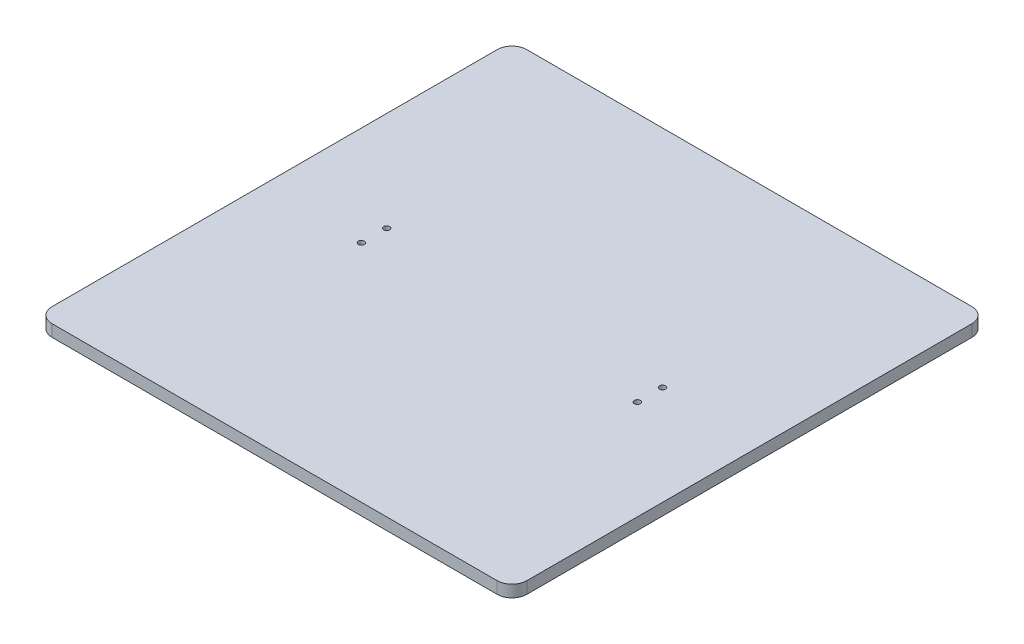
ISO-10303-21;
HEADER;
FILE_DESCRIPTION(('STEP AP214'),'2;1');
FILE_NAME('part.step','',(''),(''),'','','');
FILE_SCHEMA(('AUTOMOTIVE_DESIGN { 1 0 10303 214 1 1 1 1 }'));
ENDSEC;
DATA;
#1=APPLICATION_CONTEXT('core data for automotive mechanical design processes');
#2=APPLICATION_PROTOCOL_DEFINITION('international standard','automotive_design',2000,#1);
#3=PRODUCT_CONTEXT('',#1,'mechanical');
#4=PRODUCT('Part','Part','',(#3));
#5=PRODUCT_RELATED_PRODUCT_CATEGORY('part','',(#4));
#6=PRODUCT_DEFINITION_FORMATION('','',#4);
#7=PRODUCT_DEFINITION_CONTEXT('part definition',#1,'design');
#8=PRODUCT_DEFINITION('design','',#6,#7);
#9=PRODUCT_DEFINITION_SHAPE('','',#8);
#10=(LENGTH_UNIT() NAMED_UNIT(*) SI_UNIT(.MILLI.,.METRE.));
#11=(NAMED_UNIT(*) PLANE_ANGLE_UNIT() SI_UNIT($,.RADIAN.));
#12=(NAMED_UNIT(*) SI_UNIT($,.STERADIAN.) SOLID_ANGLE_UNIT());
#13=UNCERTAINTY_MEASURE_WITH_UNIT(LENGTH_MEASURE(1.E-05),#10,'distance_accuracy_value','');
#14=(GEOMETRIC_REPRESENTATION_CONTEXT(3) GLOBAL_UNCERTAINTY_ASSIGNED_CONTEXT((#13)) GLOBAL_UNIT_ASSIGNED_CONTEXT((#10,
#11,#12)) REPRESENTATION_CONTEXT('',''));
#15=CARTESIAN_POINT('',(0.,0.,0.));
#16=DIRECTION('',(0.,0.,1.));
#17=DIRECTION('',(1.,0.,0.));
#18=AXIS2_PLACEMENT_3D('',#15,#16,#17);
#19=CARTESIAN_POINT('',(150.,-8.,150.));
#20=DIRECTION('',(0.,1.,0.));
#21=DIRECTION('',(0.,0.,1.));
#22=AXIS2_PLACEMENT_3D('',#19,#20,#21);
#23=CYLINDRICAL_SURFACE('',#22,10.);
#24=CARTESIAN_POINT('',(150.,0.,150.));
#25=DIRECTION('',(0.,1.,0.));
#26=DIRECTION('',(0.,0.,-1.));
#27=AXIS2_PLACEMENT_3D('',#24,#25,#26);
#28=CIRCLE('',#27,10.);
#29=CARTESIAN_POINT('',(150.,0.,160.));
#30=VERTEX_POINT('',#29);
#31=CARTESIAN_POINT('',(160.,0.,150.));
#32=VERTEX_POINT('',#31);
#33=EDGE_CURVE('E135',#30,#32,#28,.T.);
#34=ORIENTED_EDGE('',*,*,#33,.F.);
#35=DIRECTION('',(0.,1.,0.));
#36=VECTOR('',#35,1.);
#37=CARTESIAN_POINT('',(150.,-8.,160.));
#38=LINE('',#37,#36);
#39=CARTESIAN_POINT('',(150.,-8.,160.));
#40=VERTEX_POINT('',#39);
#41=EDGE_CURVE('E11',#40,#30,#38,.T.);
#42=ORIENTED_EDGE('',*,*,#41,.F.);
#43=CARTESIAN_POINT('',(150.,-8.,150.));
#44=DIRECTION('',(0.,1.,0.));
#45=DIRECTION('',(0.,0.,-1.));
#46=AXIS2_PLACEMENT_3D('',#43,#44,#45);
#47=CIRCLE('',#46,10.);
#48=CARTESIAN_POINT('',(160.,-8.,150.));
#49=VERTEX_POINT('',#48);
#50=EDGE_CURVE('E156',#40,#49,#47,.T.);
#51=ORIENTED_EDGE('',*,*,#50,.T.);
#52=DIRECTION('',(0.,1.,0.));
#53=VECTOR('',#52,1.);
#54=CARTESIAN_POINT('',(160.,-8.,150.));
#55=LINE('',#54,#53);
#56=EDGE_CURVE('E41',#49,#32,#55,.T.);
#57=ORIENTED_EDGE('',*,*,#56,.T.);
#58=EDGE_LOOP('',(#34,#42,#51,#57));
#59=FACE_BOUND('',#58,.T.);
#60=ADVANCED_FACE('F38',(#59),#23,.T.);
#61=CARTESIAN_POINT('',(-150.,-8.,160.));
#62=DIRECTION('',(0.,0.,1.));
#63=DIRECTION('',(1.,0.,0.));
#64=AXIS2_PLACEMENT_3D('',#61,#62,#63);
#65=PLANE('',#64);
#66=DIRECTION('',(1.,0.,0.));
#67=VECTOR('',#66,1.);
#68=CARTESIAN_POINT('',(-150.,0.,160.));
#69=LINE('',#68,#67);
#70=CARTESIAN_POINT('',(-150.,0.,160.));
#71=VERTEX_POINT('',#70);
#72=EDGE_CURVE('E154',#71,#30,#69,.T.);
#73=ORIENTED_EDGE('',*,*,#72,.F.);
#74=DIRECTION('',(0.,1.,0.));
#75=VECTOR('',#74,1.);
#76=CARTESIAN_POINT('',(-150.,-8.,160.));
#77=LINE('',#76,#75);
#78=CARTESIAN_POINT('',(-150.,-8.,160.));
#79=VERTEX_POINT('',#78);
#80=EDGE_CURVE('E47',#79,#71,#77,.T.);
#81=ORIENTED_EDGE('',*,*,#80,.F.);
#82=DIRECTION('',(1.,0.,0.));
#83=VECTOR('',#82,1.);
#84=CARTESIAN_POINT('',(-150.,-8.,160.));
#85=LINE('',#84,#83);
#86=EDGE_CURVE('E125',#79,#40,#85,.T.);
#87=ORIENTED_EDGE('',*,*,#86,.T.);
#88=ORIENTED_EDGE('',*,*,#41,.T.);
#89=EDGE_LOOP('',(#73,#81,#87,#88));
#90=FACE_BOUND('',#89,.T.);
#91=ADVANCED_FACE('F168',(#90),#65,.T.);
#92=CARTESIAN_POINT('',(-150.,-8.,150.));
#93=DIRECTION('',(0.,1.,0.));
#94=DIRECTION('',(0.,0.,1.));
#95=AXIS2_PLACEMENT_3D('',#92,#93,#94);
#96=CYLINDRICAL_SURFACE('',#95,10.);
#97=CARTESIAN_POINT('',(-150.,0.,150.));
#98=DIRECTION('',(0.,1.,0.));
#99=DIRECTION('',(0.,0.,-1.));
#100=AXIS2_PLACEMENT_3D('',#97,#98,#99);
#101=CIRCLE('',#100,10.);
#102=CARTESIAN_POINT('',(-160.,0.,150.));
#103=VERTEX_POINT('',#102);
#104=EDGE_CURVE('E112',#103,#71,#101,.T.);
#105=ORIENTED_EDGE('',*,*,#104,.F.);
#106=DIRECTION('',(0.,1.,0.));
#107=VECTOR('',#106,1.);
#108=CARTESIAN_POINT('',(-160.,-8.,150.));
#109=LINE('',#108,#107);
#110=CARTESIAN_POINT('',(-160.,-8.,150.));
#111=VERTEX_POINT('',#110);
#112=EDGE_CURVE('E107',#111,#103,#109,.T.);
#113=ORIENTED_EDGE('',*,*,#112,.F.);
#114=CARTESIAN_POINT('',(-150.,-8.,150.));
#115=DIRECTION('',(0.,1.,0.));
#116=DIRECTION('',(0.,0.,-1.));
#117=AXIS2_PLACEMENT_3D('',#114,#115,#116);
#118=CIRCLE('',#117,10.);
#119=EDGE_CURVE('E110',#111,#79,#118,.T.);
#120=ORIENTED_EDGE('',*,*,#119,.T.);
#121=ORIENTED_EDGE('',*,*,#80,.T.);
#122=EDGE_LOOP('',(#105,#113,#120,#121));
#123=FACE_BOUND('',#122,.T.);
#124=ADVANCED_FACE('F109',(#123),#96,.T.);
#125=CARTESIAN_POINT('',(-160.,-8.,150.));
#126=DIRECTION('',(-1.,0.,0.));
#127=DIRECTION('',(0.,0.,1.));
#128=AXIS2_PLACEMENT_3D('',#125,#126,#127);
#129=PLANE('',#128);
#130=DIRECTION('',(0.,0.,1.));
#131=VECTOR('',#130,1.);
#132=CARTESIAN_POINT('',(-160.,0.,150.));
#133=LINE('',#132,#131);
#134=CARTESIAN_POINT('',(-160.,0.,-150.));
#135=VERTEX_POINT('',#134);
#136=EDGE_CURVE('E151',#135,#103,#133,.T.);
#137=ORIENTED_EDGE('',*,*,#136,.F.);
#138=DIRECTION('',(0.,1.,0.));
#139=VECTOR('',#138,1.);
#140=CARTESIAN_POINT('',(-160.,-8.,-150.));
#141=LINE('',#140,#139);
#142=CARTESIAN_POINT('',(-160.,-8.,-150.));
#143=VERTEX_POINT('',#142);
#144=EDGE_CURVE('E117',#143,#135,#141,.T.);
#145=ORIENTED_EDGE('',*,*,#144,.F.);
#146=DIRECTION('',(0.,0.,1.));
#147=VECTOR('',#146,1.);
#148=CARTESIAN_POINT('',(-160.,-8.,150.));
#149=LINE('',#148,#147);
#150=EDGE_CURVE('E123',#143,#111,#149,.T.);
#151=ORIENTED_EDGE('',*,*,#150,.T.);
#152=ORIENTED_EDGE('',*,*,#112,.T.);
#153=EDGE_LOOP('',(#137,#145,#151,#152));
#154=FACE_BOUND('',#153,.T.);
#155=ADVANCED_FACE('F127',(#154),#129,.T.);
#156=CARTESIAN_POINT('',(-150.,-8.,-150.));
#157=DIRECTION('',(0.,1.,0.));
#158=DIRECTION('',(0.,0.,1.));
#159=AXIS2_PLACEMENT_3D('',#156,#157,#158);
#160=CYLINDRICAL_SURFACE('',#159,10.);
#161=CARTESIAN_POINT('',(-150.,0.,-150.));
#162=DIRECTION('',(0.,1.,0.));
#163=DIRECTION('',(0.,0.,1.));
#164=AXIS2_PLACEMENT_3D('',#161,#162,#163);
#165=CIRCLE('',#164,10.);
#166=CARTESIAN_POINT('',(-150.,0.,-160.));
#167=VERTEX_POINT('',#166);
#168=EDGE_CURVE('E148',#167,#135,#165,.T.);
#169=ORIENTED_EDGE('',*,*,#168,.F.);
#170=DIRECTION('',(0.,1.,0.));
#171=VECTOR('',#170,1.);
#172=CARTESIAN_POINT('',(-150.,-8.,-160.));
#173=LINE('',#172,#171);
#174=CARTESIAN_POINT('',(-150.,-8.,-160.));
#175=VERTEX_POINT('',#174);
#176=EDGE_CURVE('E160',#175,#167,#173,.T.);
#177=ORIENTED_EDGE('',*,*,#176,.F.);
#178=CARTESIAN_POINT('',(-150.,-8.,-150.));
#179=DIRECTION('',(0.,1.,0.));
#180=DIRECTION('',(0.,0.,1.));
#181=AXIS2_PLACEMENT_3D('',#178,#179,#180);
#182=CIRCLE('',#181,10.);
#183=EDGE_CURVE('E128',#175,#143,#182,.T.);
#184=ORIENTED_EDGE('',*,*,#183,.T.);
#185=ORIENTED_EDGE('',*,*,#144,.T.);
#186=EDGE_LOOP('',(#169,#177,#184,#185));
#187=FACE_BOUND('',#186,.T.);
#188=ADVANCED_FACE('F181',(#187),#160,.T.);
#189=CARTESIAN_POINT('',(-150.,-8.,-160.));
#190=DIRECTION('',(0.,0.,-1.));
#191=DIRECTION('',(-1.,0.,0.));
#192=AXIS2_PLACEMENT_3D('',#189,#190,#191);
#193=PLANE('',#192);
#194=DIRECTION('',(-1.,0.,0.));
#195=VECTOR('',#194,1.);
#196=CARTESIAN_POINT('',(-150.,0.,-160.));
#197=LINE('',#196,#195);
#198=CARTESIAN_POINT('',(150.,0.,-160.));
#199=VERTEX_POINT('',#198);
#200=EDGE_CURVE('E145',#199,#167,#197,.T.);
#201=ORIENTED_EDGE('',*,*,#200,.F.);
#202=DIRECTION('',(0.,1.,0.));
#203=VECTOR('',#202,1.);
#204=CARTESIAN_POINT('',(150.,-8.,-160.));
#205=LINE('',#204,#203);
#206=CARTESIAN_POINT('',(150.,-8.,-160.));
#207=VERTEX_POINT('',#206);
#208=EDGE_CURVE('E162',#207,#199,#205,.T.);
#209=ORIENTED_EDGE('',*,*,#208,.F.);
#210=DIRECTION('',(-1.,0.,0.));
#211=VECTOR('',#210,1.);
#212=CARTESIAN_POINT('',(-150.,-8.,-160.));
#213=LINE('',#212,#211);
#214=EDGE_CURVE('E130',#207,#175,#213,.T.);
#215=ORIENTED_EDGE('',*,*,#214,.T.);
#216=ORIENTED_EDGE('',*,*,#176,.T.);
#217=EDGE_LOOP('',(#201,#209,#215,#216));
#218=FACE_BOUND('',#217,.T.);
#219=ADVANCED_FACE('F184',(#218),#193,.T.);
#220=CARTESIAN_POINT('',(150.,-8.,-150.));
#221=DIRECTION('',(0.,1.,0.));
#222=DIRECTION('',(0.,0.,1.));
#223=AXIS2_PLACEMENT_3D('',#220,#221,#222);
#224=CYLINDRICAL_SURFACE('',#223,10.);
#225=CARTESIAN_POINT('',(150.,0.,-150.));
#226=DIRECTION('',(0.,1.,0.));
#227=DIRECTION('',(0.,0.,1.));
#228=AXIS2_PLACEMENT_3D('',#225,#226,#227);
#229=CIRCLE('',#228,10.);
#230=CARTESIAN_POINT('',(160.,0.,-150.));
#231=VERTEX_POINT('',#230);
#232=EDGE_CURVE('E142',#231,#199,#229,.T.);
#233=ORIENTED_EDGE('',*,*,#232,.F.);
#234=DIRECTION('',(0.,1.,0.));
#235=VECTOR('',#234,1.);
#236=CARTESIAN_POINT('',(160.,-8.,-150.));
#237=LINE('',#236,#235);
#238=CARTESIAN_POINT('',(160.,-8.,-150.));
#239=VERTEX_POINT('',#238);
#240=EDGE_CURVE('E163',#239,#231,#237,.T.);
#241=ORIENTED_EDGE('',*,*,#240,.F.);
#242=CARTESIAN_POINT('',(150.,-8.,-150.));
#243=DIRECTION('',(0.,1.,0.));
#244=DIRECTION('',(0.,0.,1.));
#245=AXIS2_PLACEMENT_3D('',#242,#243,#244);
#246=CIRCLE('',#245,10.);
#247=EDGE_CURVE('E252',#239,#207,#246,.T.);
#248=ORIENTED_EDGE('',*,*,#247,.T.);
#249=ORIENTED_EDGE('',*,*,#208,.T.);
#250=EDGE_LOOP('',(#233,#241,#248,#249));
#251=FACE_BOUND('',#250,.T.);
#252=ADVANCED_FACE('F188',(#251),#224,.T.);
#253=CARTESIAN_POINT('',(160.,-8.,150.));
#254=DIRECTION('',(1.,0.,0.));
#255=DIRECTION('',(0.,0.,-1.));
#256=AXIS2_PLACEMENT_3D('',#253,#254,#255);
#257=PLANE('',#256);
#258=DIRECTION('',(0.,0.,-1.));
#259=VECTOR('',#258,1.);
#260=CARTESIAN_POINT('',(160.,0.,150.));
#261=LINE('',#260,#259);
#262=EDGE_CURVE('E138',#32,#231,#261,.T.);
#263=ORIENTED_EDGE('',*,*,#262,.F.);
#264=ORIENTED_EDGE('',*,*,#56,.F.);
#265=DIRECTION('',(0.,0.,-1.));
#266=VECTOR('',#265,1.);
#267=CARTESIAN_POINT('',(160.,-8.,150.));
#268=LINE('',#267,#266);
#269=EDGE_CURVE('E250',#49,#239,#268,.T.);
#270=ORIENTED_EDGE('',*,*,#269,.T.);
#271=ORIENTED_EDGE('',*,*,#240,.T.);
#272=EDGE_LOOP('',(#263,#264,#270,#271));
#273=FACE_BOUND('',#272,.T.);
#274=ADVANCED_FACE('F165',(#273),#257,.T.);
#275=CARTESIAN_POINT('',(150.,-8.,150.));
#276=DIRECTION('',(0.,-1.,0.));
#277=DIRECTION('',(0.,0.,-1.));
#278=AXIS2_PLACEMENT_3D('',#275,#276,#277);
#279=PLANE('',#278);
#280=CARTESIAN_POINT('',(-93.,-8.,-8.50000000000001));
#281=DIRECTION('',(0.,-1.,0.));
#282=DIRECTION('',(0.,0.,1.));
#283=AXIS2_PLACEMENT_3D('',#280,#281,#282);
#284=CIRCLE('',#283,2.);
#285=CARTESIAN_POINT('',(-93.,-8.,-6.50000000000001));
#286=VERTEX_POINT('',#285);
#287=EDGE_CURVE('E242',#286,#286,#284,.T.);
#288=ORIENTED_EDGE('',*,*,#287,.F.);
#289=EDGE_LOOP('',(#288));
#290=FACE_BOUND('',#289,.T.);
#291=CARTESIAN_POINT('',(93.,-8.,-8.50000000000001));
#292=DIRECTION('',(0.,-1.,0.));
#293=DIRECTION('',(0.,0.,-1.));
#294=AXIS2_PLACEMENT_3D('',#291,#292,#293);
#295=CIRCLE('',#294,2.);
#296=CARTESIAN_POINT('',(93.,-8.,-10.5));
#297=VERTEX_POINT('',#296);
#298=EDGE_CURVE('E236',#297,#297,#295,.T.);
#299=ORIENTED_EDGE('',*,*,#298,.F.);
#300=EDGE_LOOP('',(#299));
#301=FACE_BOUND('',#300,.T.);
#302=CARTESIAN_POINT('',(93.,-8.,8.50000000000001));
#303=DIRECTION('',(0.,-1.,0.));
#304=DIRECTION('',(0.,0.,1.));
#305=AXIS2_PLACEMENT_3D('',#302,#303,#304);
#306=CIRCLE('',#305,2.);
#307=CARTESIAN_POINT('',(93.,-8.,10.5));
#308=VERTEX_POINT('',#307);
#309=EDGE_CURVE('E224',#308,#308,#306,.T.);
#310=ORIENTED_EDGE('',*,*,#309,.F.);
#311=EDGE_LOOP('',(#310));
#312=FACE_BOUND('',#311,.T.);
#313=CARTESIAN_POINT('',(-93.,-8.,8.50000000000001));
#314=DIRECTION('',(0.,-1.,0.));
#315=DIRECTION('',(0.,0.,-1.));
#316=AXIS2_PLACEMENT_3D('',#313,#314,#315);
#317=CIRCLE('',#316,2.);
#318=CARTESIAN_POINT('',(-93.,-8.,6.50000000000001));
#319=VERTEX_POINT('',#318);
#320=EDGE_CURVE('E229',#319,#319,#317,.T.);
#321=ORIENTED_EDGE('',*,*,#320,.F.);
#322=EDGE_LOOP('',(#321));
#323=FACE_BOUND('',#322,.T.);
#324=ORIENTED_EDGE('',*,*,#50,.F.);
#325=ORIENTED_EDGE('',*,*,#86,.F.);
#326=ORIENTED_EDGE('',*,*,#119,.F.);
#327=ORIENTED_EDGE('',*,*,#150,.F.);
#328=ORIENTED_EDGE('',*,*,#183,.F.);
#329=ORIENTED_EDGE('',*,*,#214,.F.);
#330=ORIENTED_EDGE('',*,*,#247,.F.);
#331=ORIENTED_EDGE('',*,*,#269,.F.);
#332=EDGE_LOOP('',(#324,#325,#326,#327,#328,#329,#330,#331));
#333=FACE_BOUND('',#332,.T.);
#334=ADVANCED_FACE('F121',(#290,#301,#312,#323,#333),#279,.T.);
#335=CARTESIAN_POINT('',(150.,0.,150.));
#336=DIRECTION('',(0.,-1.,0.));
#337=DIRECTION('',(0.,0.,-1.));
#338=AXIS2_PLACEMENT_3D('',#335,#336,#337);
#339=PLANE('',#338);
#340=CARTESIAN_POINT('',(-93.,0.,-8.50000000000001));
#341=DIRECTION('',(0.,-1.,0.));
#342=DIRECTION('',(0.,0.,-1.));
#343=AXIS2_PLACEMENT_3D('',#340,#341,#342);
#344=CIRCLE('',#343,2.);
#345=CARTESIAN_POINT('',(-93.,0.,-10.5));
#346=VERTEX_POINT('',#345);
#347=EDGE_CURVE('E239',#346,#346,#344,.F.);
#348=ORIENTED_EDGE('',*,*,#347,.F.);
#349=EDGE_LOOP('',(#348));
#350=FACE_BOUND('',#349,.T.);
#351=CARTESIAN_POINT('',(93.,0.,-8.50000000000001));
#352=DIRECTION('',(0.,-1.,0.));
#353=DIRECTION('',(0.,0.,-1.));
#354=AXIS2_PLACEMENT_3D('',#351,#352,#353);
#355=CIRCLE('',#354,2.);
#356=CARTESIAN_POINT('',(93.,0.,-10.5));
#357=VERTEX_POINT('',#356);
#358=EDGE_CURVE('E233',#357,#357,#355,.F.);
#359=ORIENTED_EDGE('',*,*,#358,.F.);
#360=EDGE_LOOP('',(#359));
#361=FACE_BOUND('',#360,.T.);
#362=CARTESIAN_POINT('',(93.,0.,8.50000000000001));
#363=DIRECTION('',(0.,-1.,0.));
#364=DIRECTION('',(0.,0.,-1.));
#365=AXIS2_PLACEMENT_3D('',#362,#363,#364);
#366=CIRCLE('',#365,2.);
#367=CARTESIAN_POINT('',(93.,0.,6.50000000000001));
#368=VERTEX_POINT('',#367);
#369=EDGE_CURVE('E227',#368,#368,#366,.F.);
#370=ORIENTED_EDGE('',*,*,#369,.F.);
#371=EDGE_LOOP('',(#370));
#372=FACE_BOUND('',#371,.T.);
#373=CARTESIAN_POINT('',(-93.,0.,8.50000000000001));
#374=DIRECTION('',(0.,-1.,0.));
#375=DIRECTION('',(0.,0.,-1.));
#376=AXIS2_PLACEMENT_3D('',#373,#374,#375);
#377=CIRCLE('',#376,2.);
#378=CARTESIAN_POINT('',(-93.,0.,6.50000000000001));
#379=VERTEX_POINT('',#378);
#380=EDGE_CURVE('E139',#379,#379,#377,.F.);
#381=ORIENTED_EDGE('',*,*,#380,.F.);
#382=EDGE_LOOP('',(#381));
#383=FACE_BOUND('',#382,.T.);
#384=ORIENTED_EDGE('',*,*,#33,.T.);
#385=ORIENTED_EDGE('',*,*,#262,.T.);
#386=ORIENTED_EDGE('',*,*,#232,.T.);
#387=ORIENTED_EDGE('',*,*,#200,.T.);
#388=ORIENTED_EDGE('',*,*,#168,.T.);
#389=ORIENTED_EDGE('',*,*,#136,.T.);
#390=ORIENTED_EDGE('',*,*,#104,.T.);
#391=ORIENTED_EDGE('',*,*,#72,.T.);
#392=EDGE_LOOP('',(#384,#385,#386,#387,#388,#389,#390,#391));
#393=FACE_BOUND('',#392,.T.);
#394=ADVANCED_FACE('F167',(#350,#361,#372,#383,#393),#339,.F.);
#395=CARTESIAN_POINT('',(-93.,0.000999999999999265,8.50000000000001));
#396=DIRECTION('',(0.,-1.,0.));
#397=DIRECTION('',(0.,0.,-1.));
#398=AXIS2_PLACEMENT_3D('',#395,#396,#397);
#399=CYLINDRICAL_SURFACE('',#398,2.);
#400=ORIENTED_EDGE('',*,*,#320,.T.);
#401=EDGE_LOOP('',(#400));
#402=FACE_BOUND('',#401,.T.);
#403=ORIENTED_EDGE('',*,*,#380,.T.);
#404=EDGE_LOOP('',(#403));
#405=FACE_BOUND('',#404,.T.);
#406=ADVANCED_FACE('F200',(#402,#405),#399,.F.);
#407=CARTESIAN_POINT('',(93.,0.000999999999999265,8.50000000000001));
#408=DIRECTION('',(0.,-1.,0.));
#409=DIRECTION('',(0.,0.,-1.));
#410=AXIS2_PLACEMENT_3D('',#407,#408,#409);
#411=CYLINDRICAL_SURFACE('',#410,2.);
#412=ORIENTED_EDGE('',*,*,#309,.T.);
#413=EDGE_LOOP('',(#412));
#414=FACE_BOUND('',#413,.T.);
#415=ORIENTED_EDGE('',*,*,#369,.T.);
#416=EDGE_LOOP('',(#415));
#417=FACE_BOUND('',#416,.T.);
#418=ADVANCED_FACE('F207',(#414,#417),#411,.F.);
#419=CARTESIAN_POINT('',(93.,0.000999999999999265,-8.50000000000001));
#420=DIRECTION('',(0.,-1.,0.));
#421=DIRECTION('',(0.,0.,-1.));
#422=AXIS2_PLACEMENT_3D('',#419,#420,#421);
#423=CYLINDRICAL_SURFACE('',#422,2.);
#424=ORIENTED_EDGE('',*,*,#298,.T.);
#425=EDGE_LOOP('',(#424));
#426=FACE_BOUND('',#425,.T.);
#427=ORIENTED_EDGE('',*,*,#358,.T.);
#428=EDGE_LOOP('',(#427));
#429=FACE_BOUND('',#428,.T.);
#430=ADVANCED_FACE('F212',(#426,#429),#423,.F.);
#431=CARTESIAN_POINT('',(-93.,0.000999999999999265,-8.50000000000001));
#432=DIRECTION('',(0.,-1.,0.));
#433=DIRECTION('',(0.,0.,-1.));
#434=AXIS2_PLACEMENT_3D('',#431,#432,#433);
#435=CYLINDRICAL_SURFACE('',#434,2.);
#436=ORIENTED_EDGE('',*,*,#287,.T.);
#437=EDGE_LOOP('',(#436));
#438=FACE_BOUND('',#437,.T.);
#439=ORIENTED_EDGE('',*,*,#347,.T.);
#440=EDGE_LOOP('',(#439));
#441=FACE_BOUND('',#440,.T.);
#442=ADVANCED_FACE('F209',(#438,#441),#435,.F.);
#443=CLOSED_SHELL('',(#60,#91,#124,#155,#188,#219,#252,#274,#334,#394,#406,#418,#430,#442));
#444=MANIFOLD_SOLID_BREP('B2',#443);
#445=ADVANCED_BREP_SHAPE_REPRESENTATION('',(#18,#444),#14);
#446=SHAPE_DEFINITION_REPRESENTATION(#9,#445);
ENDSEC;
END-ISO-10303-21;
